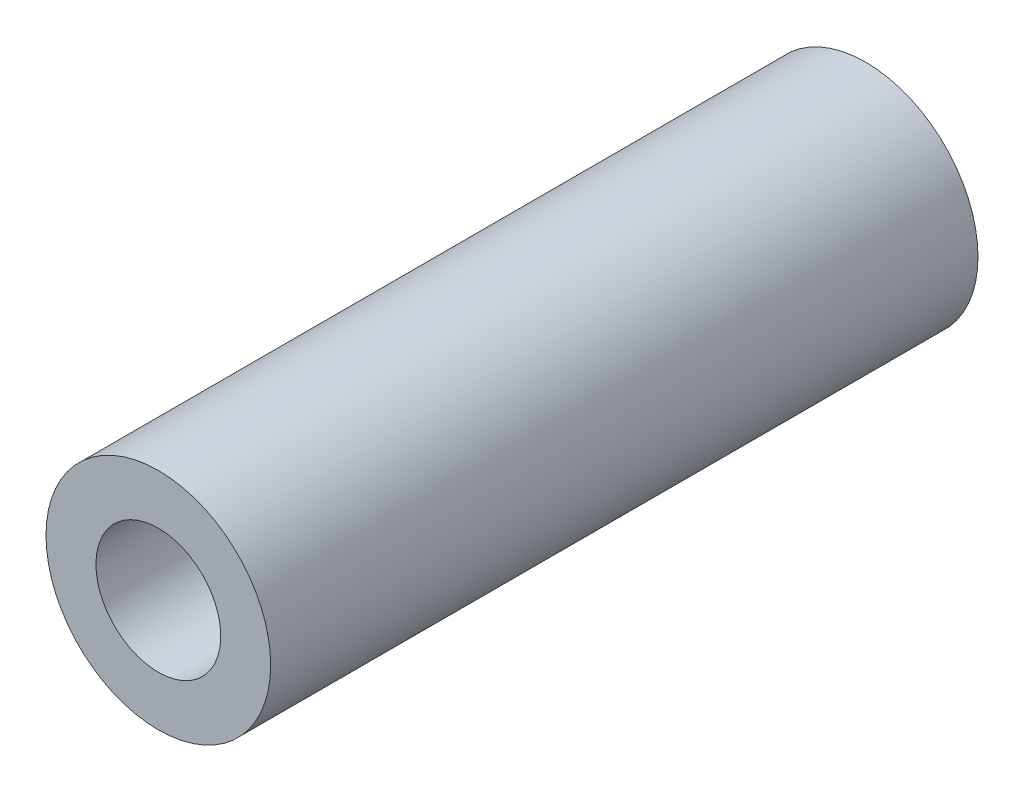
ISO-10303-21;
HEADER;
FILE_DESCRIPTION(('STEP AP214'),'2;1');
FILE_NAME('part.step','',(''),(''),'','','');
FILE_SCHEMA(('AUTOMOTIVE_DESIGN { 1 0 10303 214 1 1 1 1 }'));
ENDSEC;
DATA;
#1=APPLICATION_CONTEXT('core data for automotive mechanical design processes');
#2=APPLICATION_PROTOCOL_DEFINITION('international standard','automotive_design',2000,#1);
#3=PRODUCT_CONTEXT('',#1,'mechanical');
#4=PRODUCT('Part','Part','',(#3));
#5=PRODUCT_RELATED_PRODUCT_CATEGORY('part','',(#4));
#6=PRODUCT_DEFINITION_FORMATION('','',#4);
#7=PRODUCT_DEFINITION_CONTEXT('part definition',#1,'design');
#8=PRODUCT_DEFINITION('design','',#6,#7);
#9=PRODUCT_DEFINITION_SHAPE('','',#8);
#10=(LENGTH_UNIT() NAMED_UNIT(*) SI_UNIT(.MILLI.,.METRE.));
#11=(NAMED_UNIT(*) PLANE_ANGLE_UNIT() SI_UNIT($,.RADIAN.));
#12=(NAMED_UNIT(*) SI_UNIT($,.STERADIAN.) SOLID_ANGLE_UNIT());
#13=UNCERTAINTY_MEASURE_WITH_UNIT(LENGTH_MEASURE(1.E-05),#10,'distance_accuracy_value','');
#14=(GEOMETRIC_REPRESENTATION_CONTEXT(3) GLOBAL_UNCERTAINTY_ASSIGNED_CONTEXT((#13)) GLOBAL_UNIT_ASSIGNED_CONTEXT((#10,
#11,#12)) REPRESENTATION_CONTEXT('',''));
#15=CARTESIAN_POINT('',(0.,0.,0.));
#16=DIRECTION('',(0.,0.,1.));
#17=DIRECTION('',(1.,0.,0.));
#18=AXIS2_PLACEMENT_3D('',#15,#16,#17);
#19=CARTESIAN_POINT('',(0.,0.,-53.975));
#20=DIRECTION('',(0.,0.,-1.));
#21=DIRECTION('',(-1.,0.,0.));
#22=AXIS2_PLACEMENT_3D('',#19,#20,#21);
#23=CYLINDRICAL_SURFACE('',#22,9.52500000000001);
#24=CARTESIAN_POINT('',(0.,0.,-53.975));
#25=DIRECTION('',(0.,0.,-1.));
#26=DIRECTION('',(-1.,0.,0.));
#27=AXIS2_PLACEMENT_3D('',#24,#25,#26);
#28=CIRCLE('',#27,9.52500000000001);
#29=CARTESIAN_POINT('',(-9.52500000000001,0.,-53.975));
#30=VERTEX_POINT('',#29);
#31=EDGE_CURVE('E10',#30,#30,#28,.T.);
#32=ORIENTED_EDGE('',*,*,#31,.T.);
#33=EDGE_LOOP('',(#32));
#34=FACE_BOUND('',#33,.T.);
#35=CARTESIAN_POINT('',(0.,0.,53.975));
#36=DIRECTION('',(0.,0.,-1.));
#37=DIRECTION('',(-1.,0.,0.));
#38=AXIS2_PLACEMENT_3D('',#35,#36,#37);
#39=CIRCLE('',#38,9.52500000000001);
#40=CARTESIAN_POINT('',(-9.52500000000001,0.,53.975));
#41=VERTEX_POINT('',#40);
#42=EDGE_CURVE('E53',#41,#41,#39,.T.);
#43=ORIENTED_EDGE('',*,*,#42,.F.);
#44=EDGE_LOOP('',(#43));
#45=FACE_BOUND('',#44,.T.);
#46=ADVANCED_FACE('F39',(#34,#45),#23,.F.);
#47=CARTESIAN_POINT('',(0.,9.52499999999997,-53.975));
#48=DIRECTION('',(0.,0.,-1.));
#49=DIRECTION('',(-1.,0.,0.));
#50=AXIS2_PLACEMENT_3D('',#47,#48,#49);
#51=PLANE('',#50);
#52=CARTESIAN_POINT('',(0.,0.,-53.975));
#53=DIRECTION('',(0.,0.,-1.));
#54=DIRECTION('',(-1.,0.,0.));
#55=AXIS2_PLACEMENT_3D('',#52,#53,#54);
#56=CIRCLE('',#55,17.145);
#57=CARTESIAN_POINT('',(-17.145,0.,-53.975));
#58=VERTEX_POINT('',#57);
#59=EDGE_CURVE('E45',#58,#58,#56,.T.);
#60=ORIENTED_EDGE('',*,*,#59,.T.);
#61=EDGE_LOOP('',(#60));
#62=FACE_BOUND('',#61,.T.);
#63=ORIENTED_EDGE('',*,*,#31,.F.);
#64=EDGE_LOOP('',(#63));
#65=FACE_BOUND('',#64,.T.);
#66=ADVANCED_FACE('F63',(#62,#65),#51,.T.);
#67=CARTESIAN_POINT('',(0.,0.,-53.975));
#68=DIRECTION('',(0.,0.,-1.));
#69=DIRECTION('',(-1.,0.,0.));
#70=AXIS2_PLACEMENT_3D('',#67,#68,#69);
#71=CYLINDRICAL_SURFACE('',#70,17.145);
#72=CARTESIAN_POINT('',(0.,0.,53.975));
#73=DIRECTION('',(0.,0.,-1.));
#74=DIRECTION('',(-1.,0.,0.));
#75=AXIS2_PLACEMENT_3D('',#72,#73,#74);
#76=CIRCLE('',#75,17.145);
#77=CARTESIAN_POINT('',(-17.145,0.,53.975));
#78=VERTEX_POINT('',#77);
#79=EDGE_CURVE('E49',#78,#78,#76,.T.);
#80=ORIENTED_EDGE('',*,*,#79,.T.);
#81=EDGE_LOOP('',(#80));
#82=FACE_BOUND('',#81,.T.);
#83=ORIENTED_EDGE('',*,*,#59,.F.);
#84=EDGE_LOOP('',(#83));
#85=FACE_BOUND('',#84,.T.);
#86=ADVANCED_FACE('F67',(#82,#85),#71,.T.);
#87=CARTESIAN_POINT('',(0.,17.145,53.975));
#88=DIRECTION('',(0.,0.,1.));
#89=DIRECTION('',(1.,0.,0.));
#90=AXIS2_PLACEMENT_3D('',#87,#88,#89);
#91=PLANE('',#90);
#92=ORIENTED_EDGE('',*,*,#42,.T.);
#93=EDGE_LOOP('',(#92));
#94=FACE_BOUND('',#93,.T.);
#95=ORIENTED_EDGE('',*,*,#79,.F.);
#96=EDGE_LOOP('',(#95));
#97=FACE_BOUND('',#96,.T.);
#98=ADVANCED_FACE('F59',(#94,#97),#91,.T.);
#99=CLOSED_SHELL('',(#46,#66,#86,#98));
#100=MANIFOLD_SOLID_BREP('B2',#99);
#101=ADVANCED_BREP_SHAPE_REPRESENTATION('',(#18,#100),#14);
#102=SHAPE_DEFINITION_REPRESENTATION(#9,#101);
ENDSEC;
END-ISO-10303-21;
